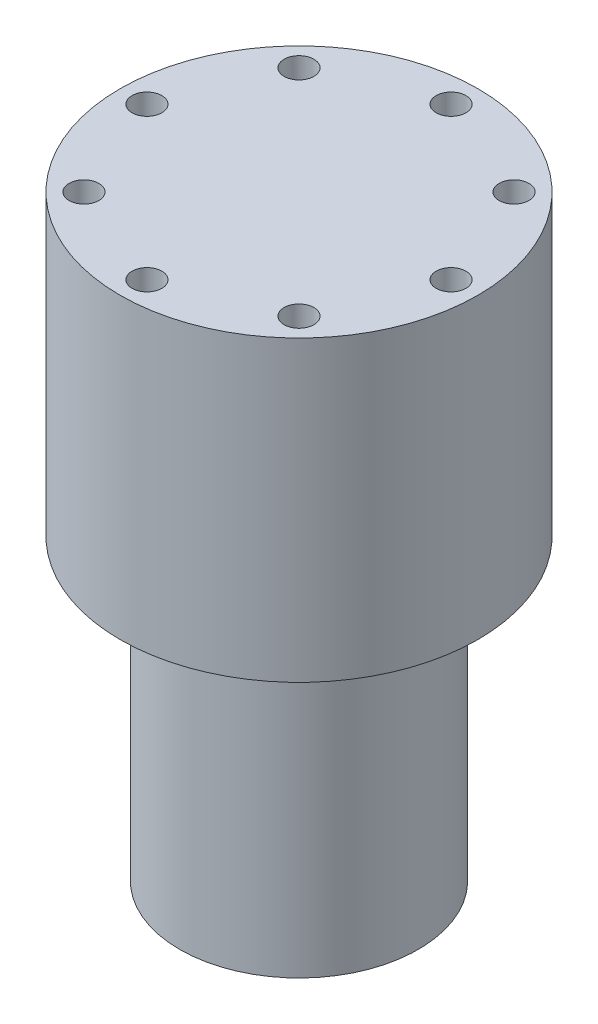
ISO-10303-21;
HEADER;
FILE_DESCRIPTION(('STEP AP214'),'2;1');
FILE_NAME('part.step','',(''),(''),'','','');
FILE_SCHEMA(('AUTOMOTIVE_DESIGN { 1 0 10303 214 1 1 1 1 }'));
ENDSEC;
DATA;
#1=APPLICATION_CONTEXT('core data for automotive mechanical design processes');
#2=APPLICATION_PROTOCOL_DEFINITION('international standard','automotive_design',2000,#1);
#3=PRODUCT_CONTEXT('',#1,'mechanical');
#4=PRODUCT('Part','Part','',(#3));
#5=PRODUCT_RELATED_PRODUCT_CATEGORY('part','',(#4));
#6=PRODUCT_DEFINITION_FORMATION('','',#4);
#7=PRODUCT_DEFINITION_CONTEXT('part definition',#1,'design');
#8=PRODUCT_DEFINITION('design','',#6,#7);
#9=PRODUCT_DEFINITION_SHAPE('','',#8);
#10=(LENGTH_UNIT() NAMED_UNIT(*) SI_UNIT(.MILLI.,.METRE.));
#11=(NAMED_UNIT(*) PLANE_ANGLE_UNIT() SI_UNIT($,.RADIAN.));
#12=(NAMED_UNIT(*) SI_UNIT($,.STERADIAN.) SOLID_ANGLE_UNIT());
#13=UNCERTAINTY_MEASURE_WITH_UNIT(LENGTH_MEASURE(1.E-05),#10,'distance_accuracy_value','');
#14=(GEOMETRIC_REPRESENTATION_CONTEXT(3) GLOBAL_UNCERTAINTY_ASSIGNED_CONTEXT((#13)) GLOBAL_UNIT_ASSIGNED_CONTEXT((#10,
#11,#12)) REPRESENTATION_CONTEXT('',''));
#15=CARTESIAN_POINT('',(0.,0.,0.));
#16=DIRECTION('',(0.,0.,1.));
#17=DIRECTION('',(1.,0.,0.));
#18=AXIS2_PLACEMENT_3D('',#15,#16,#17);
#19=CARTESIAN_POINT('',(0.,63.5,0.));
#20=DIRECTION('',(0.,-1.,0.));
#21=DIRECTION('',(0.,0.,-1.));
#22=AXIS2_PLACEMENT_3D('',#19,#20,#21);
#23=CYLINDRICAL_SURFACE('',#22,25.4);
#24=CARTESIAN_POINT('',(0.,63.5,0.));
#25=DIRECTION('',(0.,1.,0.));
#26=DIRECTION('',(0.,0.,1.));
#27=AXIS2_PLACEMENT_3D('',#24,#25,#26);
#28=CIRCLE('',#27,25.4);
#29=CARTESIAN_POINT('',(0.,63.5,25.4));
#30=VERTEX_POINT('',#29);
#31=EDGE_CURVE('E10',#30,#30,#28,.T.);
#32=ORIENTED_EDGE('',*,*,#31,.F.);
#33=EDGE_LOOP('',(#32));
#34=FACE_BOUND('',#33,.T.);
#35=CARTESIAN_POINT('',(0.,0.,0.));
#36=DIRECTION('',(0.,1.,0.));
#37=DIRECTION('',(0.,0.,1.));
#38=AXIS2_PLACEMENT_3D('',#35,#36,#37);
#39=CIRCLE('',#38,25.4);
#40=CARTESIAN_POINT('',(0.,0.,25.4));
#41=VERTEX_POINT('',#40);
#42=EDGE_CURVE('E48',#41,#41,#39,.T.);
#43=ORIENTED_EDGE('',*,*,#42,.T.);
#44=EDGE_LOOP('',(#43));
#45=FACE_BOUND('',#44,.T.);
#46=ADVANCED_FACE('F45',(#34,#45),#23,.T.);
#47=CARTESIAN_POINT('',(0.,0.,0.));
#48=DIRECTION('',(0.,1.,0.));
#49=DIRECTION('',(0.,0.,1.));
#50=AXIS2_PLACEMENT_3D('',#47,#48,#49);
#51=PLANE('',#50);
#52=ORIENTED_EDGE('',*,*,#42,.F.);
#53=EDGE_LOOP('',(#52));
#54=FACE_BOUND('',#53,.T.);
#55=ADVANCED_FACE('F157',(#54),#51,.F.);
#56=CARTESIAN_POINT('',(0.,127.,0.));
#57=DIRECTION('',(0.,-1.,0.));
#58=DIRECTION('',(0.,0.,-1.));
#59=AXIS2_PLACEMENT_3D('',#56,#57,#58);
#60=CYLINDRICAL_SURFACE('',#59,38.1);
#61=CARTESIAN_POINT('',(0.,127.,0.));
#62=DIRECTION('',(0.,1.,0.));
#63=DIRECTION('',(0.,0.,1.));
#64=AXIS2_PLACEMENT_3D('',#61,#62,#63);
#65=CIRCLE('',#64,38.1);
#66=CARTESIAN_POINT('',(0.,127.,38.1));
#67=VERTEX_POINT('',#66);
#68=EDGE_CURVE('E57',#67,#67,#65,.T.);
#69=ORIENTED_EDGE('',*,*,#68,.F.);
#70=EDGE_LOOP('',(#69));
#71=FACE_BOUND('',#70,.T.);
#72=CARTESIAN_POINT('',(0.,63.5,0.));
#73=DIRECTION('',(0.,1.,0.));
#74=DIRECTION('',(0.,0.,1.));
#75=AXIS2_PLACEMENT_3D('',#72,#73,#74);
#76=CIRCLE('',#75,38.1);
#77=CARTESIAN_POINT('',(0.,63.5,38.1));
#78=VERTEX_POINT('',#77);
#79=EDGE_CURVE('E59',#78,#78,#76,.T.);
#80=ORIENTED_EDGE('',*,*,#79,.T.);
#81=EDGE_LOOP('',(#80));
#82=FACE_BOUND('',#81,.T.);
#83=ADVANCED_FACE('F144',(#71,#82),#60,.T.);
#84=CARTESIAN_POINT('',(0.,127.,0.));
#85=DIRECTION('',(0.,1.,0.));
#86=DIRECTION('',(0.,0.,1.));
#87=AXIS2_PLACEMENT_3D('',#84,#85,#86);
#88=PLANE('',#87);
#89=CARTESIAN_POINT('',(-32.3772279736929,127.,0.));
#90=DIRECTION('',(0.,1.,0.));
#91=DIRECTION('',(1.,0.,0.));
#92=AXIS2_PLACEMENT_3D('',#89,#90,#91);
#93=CIRCLE('',#92,3.175);
#94=CARTESIAN_POINT('',(-29.2022279736929,127.,0.));
#95=VERTEX_POINT('',#94);
#96=EDGE_CURVE('E108',#95,#95,#93,.T.);
#97=ORIENTED_EDGE('',*,*,#96,.F.);
#98=EDGE_LOOP('',(#97));
#99=FACE_BOUND('',#98,.T.);
#100=CARTESIAN_POINT('',(-22.8941574562209,127.,22.8941574562211));
#101=DIRECTION('',(0.,1.,0.));
#102=DIRECTION('',(0.707106781186545,0.,-0.70710678118655));
#103=AXIS2_PLACEMENT_3D('',#100,#101,#102);
#104=CIRCLE('',#103,3.175);
#105=CARTESIAN_POINT('',(-20.6490934259537,127.,20.6490934259538));
#106=VERTEX_POINT('',#105);
#107=EDGE_CURVE('E100',#106,#106,#104,.T.);
#108=ORIENTED_EDGE('',*,*,#107,.F.);
#109=EDGE_LOOP('',(#108));
#110=FACE_BOUND('',#109,.T.);
#111=CARTESIAN_POINT('',(1.68575464195347E-13,127.,32.3772279736929));
#112=DIRECTION('',(0.,1.,0.));
#113=DIRECTION('',(0.,0.,-1.));
#114=AXIS2_PLACEMENT_3D('',#111,#112,#113);
#115=CIRCLE('',#114,3.175);
#116=CARTESIAN_POINT('',(1.52044490658789E-13,127.,29.2022279736929));
#117=VERTEX_POINT('',#116);
#118=EDGE_CURVE('E92',#117,#117,#115,.T.);
#119=ORIENTED_EDGE('',*,*,#118,.F.);
#120=EDGE_LOOP('',(#119));
#121=FACE_BOUND('',#120,.T.);
#122=CARTESIAN_POINT('',(22.8941574562212,127.,22.8941574562209));
#123=DIRECTION('',(0.,1.,0.));
#124=DIRECTION('',(-0.707106781186552,0.,-0.707106781186543));
#125=AXIS2_PLACEMENT_3D('',#122,#123,#124);
#126=CIRCLE('',#125,3.175);
#127=CARTESIAN_POINT('',(20.6490934259539,127.,20.6490934259536));
#128=VERTEX_POINT('',#127);
#129=EDGE_CURVE('E83',#128,#128,#126,.T.);
#130=ORIENTED_EDGE('',*,*,#129,.F.);
#131=EDGE_LOOP('',(#130));
#132=FACE_BOUND('',#131,.T.);
#133=CARTESIAN_POINT('',(32.3772279736929,127.,-2.5286319629302E-13));
#134=DIRECTION('',(0.,1.,0.));
#135=DIRECTION('',(-1.,0.,0.));
#136=AXIS2_PLACEMENT_3D('',#133,#134,#135);
#137=CIRCLE('',#136,3.175);
#138=CARTESIAN_POINT('',(29.2022279736929,127.,-2.28066735988183E-13));
#139=VERTEX_POINT('',#138);
#140=EDGE_CURVE('E123',#139,#139,#137,.T.);
#141=ORIENTED_EDGE('',*,*,#140,.F.);
#142=EDGE_LOOP('',(#141));
#143=FACE_BOUND('',#142,.T.);
#144=CARTESIAN_POINT('',(22.8941574562208,127.,-22.8941574562213));
#145=DIRECTION('',(0.,1.,0.));
#146=DIRECTION('',(-0.707106781186541,0.,0.707106781186554));
#147=AXIS2_PLACEMENT_3D('',#144,#145,#146);
#148=CIRCLE('',#147,3.175);
#149=CARTESIAN_POINT('',(20.6490934259536,127.,-20.6490934259539));
#150=VERTEX_POINT('',#149);
#151=EDGE_CURVE('E115',#150,#150,#148,.T.);
#152=ORIENTED_EDGE('',*,*,#151,.F.);
#153=EDGE_LOOP('',(#152));
#154=FACE_BOUND('',#153,.T.);
#155=CARTESIAN_POINT('',(-22.8941574562211,127.,-22.894157456221));
#156=DIRECTION('',(0.,1.,0.));
#157=DIRECTION('',(0.707106781186548,0.,0.707106781186547));
#158=AXIS2_PLACEMENT_3D('',#155,#156,#157);
#159=CIRCLE('',#158,3.175);
#160=CARTESIAN_POINT('',(-20.6490934259538,127.,-20.6490934259537));
#161=VERTEX_POINT('',#160);
#162=EDGE_CURVE('E75',#161,#161,#159,.T.);
#163=ORIENTED_EDGE('',*,*,#162,.F.);
#164=EDGE_LOOP('',(#163));
#165=FACE_BOUND('',#164,.T.);
#166=CARTESIAN_POINT('',(0.,127.,-32.3772279736929));
#167=DIRECTION('',(0.,1.,0.));
#168=DIRECTION('',(0.,0.,1.));
#169=AXIS2_PLACEMENT_3D('',#166,#167,#168);
#170=CIRCLE('',#169,3.175);
#171=CARTESIAN_POINT('',(0.,127.,-29.2022279736929));
#172=VERTEX_POINT('',#171);
#173=EDGE_CURVE('E67',#172,#172,#170,.T.);
#174=ORIENTED_EDGE('',*,*,#173,.F.);
#175=EDGE_LOOP('',(#174));
#176=FACE_BOUND('',#175,.T.);
#177=ORIENTED_EDGE('',*,*,#68,.T.);
#178=EDGE_LOOP('',(#177));
#179=FACE_BOUND('',#178,.T.);
#180=ADVANCED_FACE('F140',(#99,#110,#121,#132,#143,#154,#165,#176,#179),#88,.T.);
#181=CARTESIAN_POINT('',(0.,63.5,0.));
#182=DIRECTION('',(0.,1.,0.));
#183=DIRECTION('',(0.,0.,1.));
#184=AXIS2_PLACEMENT_3D('',#181,#182,#183);
#185=PLANE('',#184);
#186=ORIENTED_EDGE('',*,*,#31,.T.);
#187=EDGE_LOOP('',(#186));
#188=FACE_BOUND('',#187,.T.);
#189=ORIENTED_EDGE('',*,*,#79,.F.);
#190=EDGE_LOOP('',(#189));
#191=FACE_BOUND('',#190,.T.);
#192=ADVANCED_FACE('F143',(#188,#191),#185,.F.);
#193=CARTESIAN_POINT('',(0.,101.6,-32.3772279736929));
#194=DIRECTION('',(0.,1.,0.));
#195=DIRECTION('',(0.,0.,1.));
#196=AXIS2_PLACEMENT_3D('',#193,#194,#195);
#197=CYLINDRICAL_SURFACE('',#196,3.175);
#198=CARTESIAN_POINT('',(0.,101.6,-32.3772279736929));
#199=DIRECTION('',(0.,1.,0.));
#200=DIRECTION('',(0.,0.,1.));
#201=AXIS2_PLACEMENT_3D('',#198,#199,#200);
#202=CIRCLE('',#201,3.175);
#203=CARTESIAN_POINT('',(0.,101.6,-29.2022279736929));
#204=VERTEX_POINT('',#203);
#205=EDGE_CURVE('E63',#204,#204,#202,.T.);
#206=ORIENTED_EDGE('',*,*,#205,.F.);
#207=EDGE_LOOP('',(#206));
#208=FACE_BOUND('',#207,.T.);
#209=ORIENTED_EDGE('',*,*,#173,.T.);
#210=EDGE_LOOP('',(#209));
#211=FACE_BOUND('',#210,.T.);
#212=ADVANCED_FACE('F162',(#208,#211),#197,.F.);
#213=CARTESIAN_POINT('',(0.,101.6,-32.3772279736929));
#214=DIRECTION('',(0.,1.,0.));
#215=DIRECTION('',(0.,0.,1.));
#216=AXIS2_PLACEMENT_3D('',#213,#214,#215);
#217=PLANE('',#216);
#218=ORIENTED_EDGE('',*,*,#205,.T.);
#219=EDGE_LOOP('',(#218));
#220=FACE_BOUND('',#219,.T.);
#221=ADVANCED_FACE('F167',(#220),#217,.T.);
#222=CARTESIAN_POINT('',(-22.8941574562211,101.6,-22.894157456221));
#223=DIRECTION('',(0.,1.,0.));
#224=DIRECTION('',(0.,0.,1.));
#225=AXIS2_PLACEMENT_3D('',#222,#223,#224);
#226=CYLINDRICAL_SURFACE('',#225,3.175);
#227=CARTESIAN_POINT('',(-22.8941574562211,101.6,-22.894157456221));
#228=DIRECTION('',(0.,1.,0.));
#229=DIRECTION('',(0.707106781186548,0.,0.707106781186547));
#230=AXIS2_PLACEMENT_3D('',#227,#228,#229);
#231=CIRCLE('',#230,3.175);
#232=CARTESIAN_POINT('',(-20.6490934259538,101.6,-20.6490934259537));
#233=VERTEX_POINT('',#232);
#234=EDGE_CURVE('E71',#233,#233,#231,.T.);
#235=ORIENTED_EDGE('',*,*,#234,.F.);
#236=EDGE_LOOP('',(#235));
#237=FACE_BOUND('',#236,.T.);
#238=ORIENTED_EDGE('',*,*,#162,.T.);
#239=EDGE_LOOP('',(#238));
#240=FACE_BOUND('',#239,.T.);
#241=ADVANCED_FACE('F212',(#237,#240),#226,.F.);
#242=CARTESIAN_POINT('',(-22.8941574562211,101.6,-22.894157456221));
#243=DIRECTION('',(0.,1.,0.));
#244=DIRECTION('',(0.707106781186548,0.,0.707106781186547));
#245=AXIS2_PLACEMENT_3D('',#242,#243,#244);
#246=PLANE('',#245);
#247=ORIENTED_EDGE('',*,*,#234,.T.);
#248=EDGE_LOOP('',(#247));
#249=FACE_BOUND('',#248,.T.);
#250=ADVANCED_FACE('F221',(#249),#246,.T.);
#251=CARTESIAN_POINT('',(22.8941574562208,101.6,-22.8941574562213));
#252=DIRECTION('',(0.,1.,0.));
#253=DIRECTION('',(0.,0.,1.));
#254=AXIS2_PLACEMENT_3D('',#251,#252,#253);
#255=CYLINDRICAL_SURFACE('',#254,3.175);
#256=CARTESIAN_POINT('',(22.8941574562208,101.6,-22.8941574562213));
#257=DIRECTION('',(0.,1.,0.));
#258=DIRECTION('',(-0.707106781186541,0.,0.707106781186554));
#259=AXIS2_PLACEMENT_3D('',#256,#257,#258);
#260=CIRCLE('',#259,3.175);
#261=CARTESIAN_POINT('',(20.6490934259536,101.6,-20.6490934259539));
#262=VERTEX_POINT('',#261);
#263=EDGE_CURVE('E119',#262,#262,#260,.T.);
#264=ORIENTED_EDGE('',*,*,#263,.F.);
#265=EDGE_LOOP('',(#264));
#266=FACE_BOUND('',#265,.T.);
#267=ORIENTED_EDGE('',*,*,#151,.T.);
#268=EDGE_LOOP('',(#267));
#269=FACE_BOUND('',#268,.T.);
#270=ADVANCED_FACE('F231',(#266,#269),#255,.F.);
#271=CARTESIAN_POINT('',(22.8941574562208,101.6,-22.8941574562213));
#272=DIRECTION('',(0.,1.,0.));
#273=DIRECTION('',(-0.707106781186541,0.,0.707106781186554));
#274=AXIS2_PLACEMENT_3D('',#271,#272,#273);
#275=PLANE('',#274);
#276=ORIENTED_EDGE('',*,*,#263,.T.);
#277=EDGE_LOOP('',(#276));
#278=FACE_BOUND('',#277,.T.);
#279=ADVANCED_FACE('F136',(#278),#275,.T.);
#280=CARTESIAN_POINT('',(32.3772279736929,101.6,-2.5286319629302E-13));
#281=DIRECTION('',(0.,1.,0.));
#282=DIRECTION('',(0.,0.,1.));
#283=AXIS2_PLACEMENT_3D('',#280,#281,#282);
#284=CYLINDRICAL_SURFACE('',#283,3.175);
#285=CARTESIAN_POINT('',(32.3772279736929,101.6,-2.5286319629302E-13));
#286=DIRECTION('',(0.,1.,0.));
#287=DIRECTION('',(-1.,0.,0.));
#288=AXIS2_PLACEMENT_3D('',#285,#286,#287);
#289=CIRCLE('',#288,3.175);
#290=CARTESIAN_POINT('',(29.2022279736929,101.6,-2.28066735988183E-13));
#291=VERTEX_POINT('',#290);
#292=EDGE_CURVE('E88',#291,#291,#289,.T.);
#293=ORIENTED_EDGE('',*,*,#292,.F.);
#294=EDGE_LOOP('',(#293));
#295=FACE_BOUND('',#294,.T.);
#296=ORIENTED_EDGE('',*,*,#140,.T.);
#297=EDGE_LOOP('',(#296));
#298=FACE_BOUND('',#297,.T.);
#299=ADVANCED_FACE('F133',(#295,#298),#284,.F.);
#300=CARTESIAN_POINT('',(32.3772279736929,101.6,-2.5286319629302E-13));
#301=DIRECTION('',(0.,1.,0.));
#302=DIRECTION('',(-1.,0.,0.));
#303=AXIS2_PLACEMENT_3D('',#300,#301,#302);
#304=PLANE('',#303);
#305=ORIENTED_EDGE('',*,*,#292,.T.);
#306=EDGE_LOOP('',(#305));
#307=FACE_BOUND('',#306,.T.);
#308=ADVANCED_FACE('F131',(#307),#304,.T.);
#309=CARTESIAN_POINT('',(22.8941574562212,101.6,22.8941574562209));
#310=DIRECTION('',(0.,1.,0.));
#311=DIRECTION('',(0.,0.,1.));
#312=AXIS2_PLACEMENT_3D('',#309,#310,#311);
#313=CYLINDRICAL_SURFACE('',#312,3.175);
#314=CARTESIAN_POINT('',(22.8941574562212,101.6,22.8941574562209));
#315=DIRECTION('',(0.,1.,0.));
#316=DIRECTION('',(-0.707106781186552,0.,-0.707106781186543));
#317=AXIS2_PLACEMENT_3D('',#314,#315,#316);
#318=CIRCLE('',#317,3.175);
#319=CARTESIAN_POINT('',(20.6490934259539,101.6,20.6490934259536));
#320=VERTEX_POINT('',#319);
#321=EDGE_CURVE('E87',#320,#320,#318,.T.);
#322=ORIENTED_EDGE('',*,*,#321,.F.);
#323=EDGE_LOOP('',(#322));
#324=FACE_BOUND('',#323,.T.);
#325=ORIENTED_EDGE('',*,*,#129,.T.);
#326=EDGE_LOOP('',(#325));
#327=FACE_BOUND('',#326,.T.);
#328=ADVANCED_FACE('F265',(#324,#327),#313,.F.);
#329=CARTESIAN_POINT('',(22.8941574562212,101.6,22.8941574562209));
#330=DIRECTION('',(0.,1.,0.));
#331=DIRECTION('',(-0.707106781186552,0.,-0.707106781186543));
#332=AXIS2_PLACEMENT_3D('',#329,#330,#331);
#333=PLANE('',#332);
#334=ORIENTED_EDGE('',*,*,#321,.T.);
#335=EDGE_LOOP('',(#334));
#336=FACE_BOUND('',#335,.T.);
#337=ADVANCED_FACE('F274',(#336),#333,.T.);
#338=CARTESIAN_POINT('',(1.68575464195347E-13,101.6,32.3772279736929));
#339=DIRECTION('',(0.,1.,0.));
#340=DIRECTION('',(0.,0.,1.));
#341=AXIS2_PLACEMENT_3D('',#338,#339,#340);
#342=CYLINDRICAL_SURFACE('',#341,3.175);
#343=CARTESIAN_POINT('',(1.68575464195347E-13,101.6,32.3772279736929));
#344=DIRECTION('',(0.,1.,0.));
#345=DIRECTION('',(0.,0.,-1.));
#346=AXIS2_PLACEMENT_3D('',#343,#344,#345);
#347=CIRCLE('',#346,3.175);
#348=CARTESIAN_POINT('',(1.52044490658789E-13,101.6,29.2022279736929));
#349=VERTEX_POINT('',#348);
#350=EDGE_CURVE('E96',#349,#349,#347,.T.);
#351=ORIENTED_EDGE('',*,*,#350,.F.);
#352=EDGE_LOOP('',(#351));
#353=FACE_BOUND('',#352,.T.);
#354=ORIENTED_EDGE('',*,*,#118,.T.);
#355=EDGE_LOOP('',(#354));
#356=FACE_BOUND('',#355,.T.);
#357=ADVANCED_FACE('F284',(#353,#356),#342,.F.);
#358=CARTESIAN_POINT('',(1.68575464195347E-13,101.6,32.3772279736929));
#359=DIRECTION('',(0.,1.,0.));
#360=DIRECTION('',(0.,0.,-1.));
#361=AXIS2_PLACEMENT_3D('',#358,#359,#360);
#362=PLANE('',#361);
#363=ORIENTED_EDGE('',*,*,#350,.T.);
#364=EDGE_LOOP('',(#363));
#365=FACE_BOUND('',#364,.T.);
#366=ADVANCED_FACE('F294',(#365),#362,.T.);
#367=CARTESIAN_POINT('',(-22.8941574562209,101.6,22.8941574562211));
#368=DIRECTION('',(0.,1.,0.));
#369=DIRECTION('',(0.,0.,1.));
#370=AXIS2_PLACEMENT_3D('',#367,#368,#369);
#371=CYLINDRICAL_SURFACE('',#370,3.175);
#372=CARTESIAN_POINT('',(-22.8941574562209,101.6,22.8941574562211));
#373=DIRECTION('',(0.,1.,0.));
#374=DIRECTION('',(0.707106781186545,0.,-0.70710678118655));
#375=AXIS2_PLACEMENT_3D('',#372,#373,#374);
#376=CIRCLE('',#375,3.175);
#377=CARTESIAN_POINT('',(-20.6490934259537,101.6,20.6490934259538));
#378=VERTEX_POINT('',#377);
#379=EDGE_CURVE('E104',#378,#378,#376,.T.);
#380=ORIENTED_EDGE('',*,*,#379,.F.);
#381=EDGE_LOOP('',(#380));
#382=FACE_BOUND('',#381,.T.);
#383=ORIENTED_EDGE('',*,*,#107,.T.);
#384=EDGE_LOOP('',(#383));
#385=FACE_BOUND('',#384,.T.);
#386=ADVANCED_FACE('F304',(#382,#385),#371,.F.);
#387=CARTESIAN_POINT('',(-22.8941574562209,101.6,22.8941574562211));
#388=DIRECTION('',(0.,1.,0.));
#389=DIRECTION('',(0.707106781186545,0.,-0.70710678118655));
#390=AXIS2_PLACEMENT_3D('',#387,#388,#389);
#391=PLANE('',#390);
#392=ORIENTED_EDGE('',*,*,#379,.T.);
#393=EDGE_LOOP('',(#392));
#394=FACE_BOUND('',#393,.T.);
#395=ADVANCED_FACE('F314',(#394),#391,.T.);
#396=CARTESIAN_POINT('',(-32.3772279736929,101.6,0.));
#397=DIRECTION('',(0.,1.,0.));
#398=DIRECTION('',(0.,0.,1.));
#399=AXIS2_PLACEMENT_3D('',#396,#397,#398);
#400=CYLINDRICAL_SURFACE('',#399,3.175);
#401=CARTESIAN_POINT('',(-32.3772279736929,101.6,0.));
#402=DIRECTION('',(0.,1.,0.));
#403=DIRECTION('',(1.,0.,0.));
#404=AXIS2_PLACEMENT_3D('',#401,#402,#403);
#405=CIRCLE('',#404,3.175);
#406=CARTESIAN_POINT('',(-29.2022279736929,101.6,0.));
#407=VERTEX_POINT('',#406);
#408=EDGE_CURVE('E79',#407,#407,#405,.T.);
#409=ORIENTED_EDGE('',*,*,#408,.F.);
#410=EDGE_LOOP('',(#409));
#411=FACE_BOUND('',#410,.T.);
#412=ORIENTED_EDGE('',*,*,#96,.T.);
#413=EDGE_LOOP('',(#412));
#414=FACE_BOUND('',#413,.T.);
#415=ADVANCED_FACE('F324',(#411,#414),#400,.F.);
#416=CARTESIAN_POINT('',(-32.3772279736929,101.6,0.));
#417=DIRECTION('',(0.,1.,0.));
#418=DIRECTION('',(1.,0.,0.));
#419=AXIS2_PLACEMENT_3D('',#416,#417,#418);
#420=PLANE('',#419);
#421=ORIENTED_EDGE('',*,*,#408,.T.);
#422=EDGE_LOOP('',(#421));
#423=FACE_BOUND('',#422,.T.);
#424=ADVANCED_FACE('F334',(#423),#420,.T.);
#425=CLOSED_SHELL('',(#46,#55,#83,#180,#192,#212,#221,#241,#250,#270,#279,#299,#308,#328,#337,
#357,#366,#386,#395,#415,#424));
#426=MANIFOLD_SOLID_BREP('B2',#425);
#427=ADVANCED_BREP_SHAPE_REPRESENTATION('',(#18,#426),#14);
#428=SHAPE_DEFINITION_REPRESENTATION(#9,#427);
ENDSEC;
END-ISO-10303-21;
